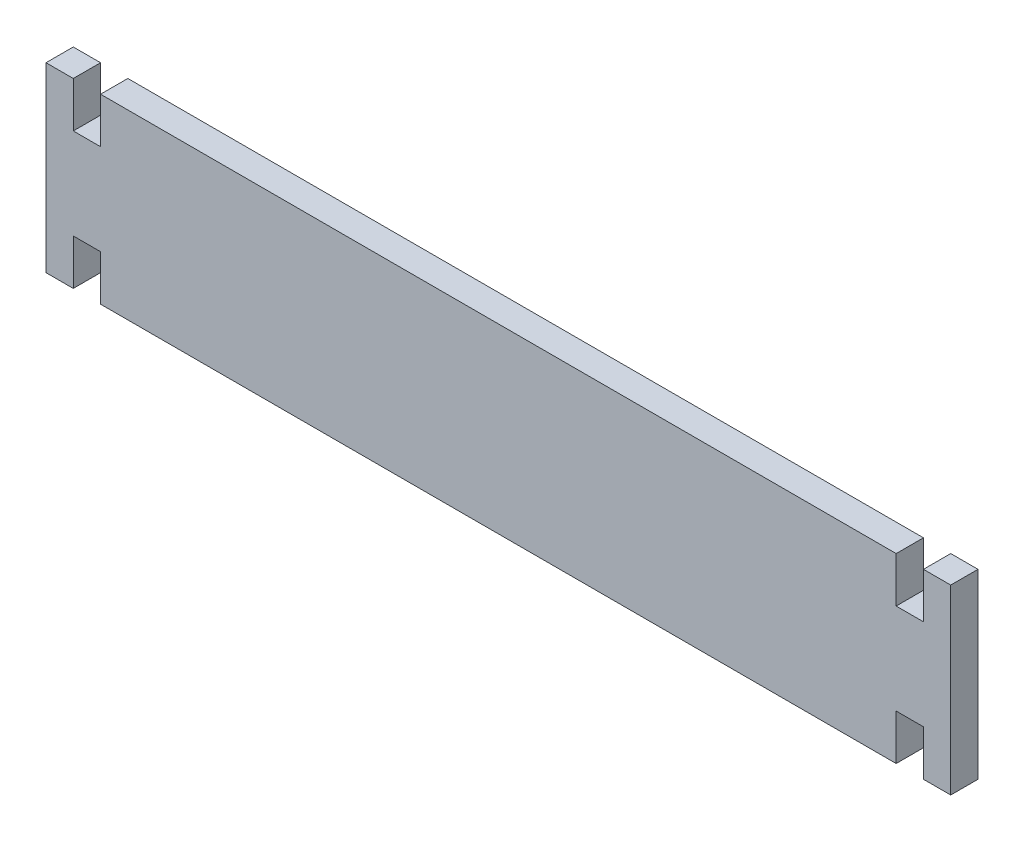
ISO-10303-21;
HEADER;
FILE_DESCRIPTION(('STEP AP214'),'2;1');
FILE_NAME('part.step','',(''),(''),'','','');
FILE_SCHEMA(('AUTOMOTIVE_DESIGN { 1 0 10303 214 1 1 1 1 }'));
ENDSEC;
DATA;
#1=APPLICATION_CONTEXT('core data for automotive mechanical design processes');
#2=APPLICATION_PROTOCOL_DEFINITION('international standard','automotive_design',2000,#1);
#3=PRODUCT_CONTEXT('',#1,'mechanical');
#4=PRODUCT('Part','Part','',(#3));
#5=PRODUCT_RELATED_PRODUCT_CATEGORY('part','',(#4));
#6=PRODUCT_DEFINITION_FORMATION('','',#4);
#7=PRODUCT_DEFINITION_CONTEXT('part definition',#1,'design');
#8=PRODUCT_DEFINITION('design','',#6,#7);
#9=PRODUCT_DEFINITION_SHAPE('','',#8);
#10=(LENGTH_UNIT() NAMED_UNIT(*) SI_UNIT(.MILLI.,.METRE.));
#11=(NAMED_UNIT(*) PLANE_ANGLE_UNIT() SI_UNIT($,.RADIAN.));
#12=(NAMED_UNIT(*) SI_UNIT($,.STERADIAN.) SOLID_ANGLE_UNIT());
#13=UNCERTAINTY_MEASURE_WITH_UNIT(LENGTH_MEASURE(1.E-05),#10,'distance_accuracy_value','');
#14=(GEOMETRIC_REPRESENTATION_CONTEXT(3) GLOBAL_UNCERTAINTY_ASSIGNED_CONTEXT((#13)) GLOBAL_UNIT_ASSIGNED_CONTEXT((#10,
#11,#12)) REPRESENTATION_CONTEXT('',''));
#15=CARTESIAN_POINT('',(0.,0.,0.));
#16=DIRECTION('',(0.,0.,1.));
#17=DIRECTION('',(1.,0.,0.));
#18=AXIS2_PLACEMENT_3D('',#15,#16,#17);
#19=CARTESIAN_POINT('',(0.,40.,6.));
#20=DIRECTION('',(0.,-1.,0.));
#21=DIRECTION('',(1.,0.,0.));
#22=AXIS2_PLACEMENT_3D('',#19,#20,#21);
#23=PLANE('',#22);
#24=DIRECTION('',(-1.,0.,0.));
#25=VECTOR('',#24,1.);
#26=CARTESIAN_POINT('',(0.,40.,6.));
#27=LINE('',#26,#25);
#28=CARTESIAN_POINT('',(-12.,40.,6.));
#29=VERTEX_POINT('',#28);
#30=CARTESIAN_POINT('',(-187.,40.,6.));
#31=VERTEX_POINT('',#30);
#32=EDGE_CURVE('E256',#29,#31,#27,.T.);
#33=ORIENTED_EDGE('',*,*,#32,.F.);
#34=DIRECTION('',(0.,0.,1.));
#35=VECTOR('',#34,1.);
#36=CARTESIAN_POINT('',(-12.,40.,0.));
#37=LINE('',#36,#35);
#38=CARTESIAN_POINT('',(-12.,40.,0.));
#39=VERTEX_POINT('',#38);
#40=EDGE_CURVE('E342',#39,#29,#37,.T.);
#41=ORIENTED_EDGE('',*,*,#40,.F.);
#42=DIRECTION('',(-1.,0.,0.));
#43=VECTOR('',#42,1.);
#44=CARTESIAN_POINT('',(0.,40.,0.));
#45=LINE('',#44,#43);
#46=CARTESIAN_POINT('',(-187.,40.,0.));
#47=VERTEX_POINT('',#46);
#48=EDGE_CURVE('E235',#39,#47,#45,.T.);
#49=ORIENTED_EDGE('',*,*,#48,.T.);
#50=DIRECTION('',(0.,0.,1.));
#51=VECTOR('',#50,1.);
#52=CARTESIAN_POINT('',(-187.,40.,0.));
#53=LINE('',#52,#51);
#54=EDGE_CURVE('E265',#47,#31,#53,.T.);
#55=ORIENTED_EDGE('',*,*,#54,.T.);
#56=EDGE_LOOP('',(#33,#41,#49,#55));
#57=FACE_BOUND('',#56,.T.);
#58=ADVANCED_FACE('F44',(#57),#23,.F.);
#59=CARTESIAN_POINT('',(0.,0.,6.));
#60=DIRECTION('',(0.,1.,0.));
#61=DIRECTION('',(-1.,0.,0.));
#62=AXIS2_PLACEMENT_3D('',#59,#60,#61);
#63=PLANE('',#62);
#64=DIRECTION('',(1.,0.,0.));
#65=VECTOR('',#64,1.);
#66=CARTESIAN_POINT('',(0.,0.,0.));
#67=LINE('',#66,#65);
#68=CARTESIAN_POINT('',(-199.,0.,0.));
#69=VERTEX_POINT('',#68);
#70=CARTESIAN_POINT('',(-193.,0.,0.));
#71=VERTEX_POINT('',#70);
#72=EDGE_CURVE('E199',#69,#71,#67,.T.);
#73=ORIENTED_EDGE('',*,*,#72,.T.);
#74=DIRECTION('',(0.,0.,1.));
#75=VECTOR('',#74,1.);
#76=CARTESIAN_POINT('',(-193.,0.,0.));
#77=LINE('',#76,#75);
#78=CARTESIAN_POINT('',(-193.,0.,6.));
#79=VERTEX_POINT('',#78);
#80=EDGE_CURVE('E182',#71,#79,#77,.T.);
#81=ORIENTED_EDGE('',*,*,#80,.T.);
#82=DIRECTION('',(1.,0.,0.));
#83=VECTOR('',#82,1.);
#84=CARTESIAN_POINT('',(0.,0.,6.));
#85=LINE('',#84,#83);
#86=CARTESIAN_POINT('',(-199.,0.,6.));
#87=VERTEX_POINT('',#86);
#88=EDGE_CURVE('E244',#87,#79,#85,.T.);
#89=ORIENTED_EDGE('',*,*,#88,.F.);
#90=DIRECTION('',(0.,0.,-1.));
#91=VECTOR('',#90,1.);
#92=CARTESIAN_POINT('',(-199.,0.,6.));
#93=LINE('',#92,#91);
#94=EDGE_CURVE('E208',#87,#69,#93,.T.);
#95=ORIENTED_EDGE('',*,*,#94,.T.);
#96=EDGE_LOOP('',(#73,#81,#89,#95));
#97=FACE_BOUND('',#96,.T.);
#98=ADVANCED_FACE('F206',(#97),#63,.F.);
#99=CARTESIAN_POINT('',(-187.,0.,6.));
#100=VERTEX_POINT('',#99);
#101=CARTESIAN_POINT('',(-12.,0.,6.));
#102=VERTEX_POINT('',#101);
#103=EDGE_CURVE('E248',#100,#102,#85,.T.);
#104=ORIENTED_EDGE('',*,*,#103,.F.);
#105=DIRECTION('',(0.,0.,1.));
#106=VECTOR('',#105,1.);
#107=CARTESIAN_POINT('',(-187.,0.,0.));
#108=LINE('',#107,#106);
#109=CARTESIAN_POINT('',(-187.,0.,0.));
#110=VERTEX_POINT('',#109);
#111=EDGE_CURVE('E193',#110,#100,#108,.T.);
#112=ORIENTED_EDGE('',*,*,#111,.F.);
#113=CARTESIAN_POINT('',(-12.,0.,0.));
#114=VERTEX_POINT('',#113);
#115=EDGE_CURVE('E211',#110,#114,#67,.T.);
#116=ORIENTED_EDGE('',*,*,#115,.T.);
#117=DIRECTION('',(0.,0.,1.));
#118=VECTOR('',#117,1.);
#119=CARTESIAN_POINT('',(-12.,0.,0.));
#120=LINE('',#119,#118);
#121=EDGE_CURVE('E295',#114,#102,#120,.T.);
#122=ORIENTED_EDGE('',*,*,#121,.T.);
#123=EDGE_LOOP('',(#104,#112,#116,#122));
#124=FACE_BOUND('',#123,.T.);
#125=ADVANCED_FACE('F391',(#124),#63,.F.);
#126=CARTESIAN_POINT('',(-193.,40.,6.));
#127=VERTEX_POINT('',#126);
#128=CARTESIAN_POINT('',(-199.,40.,6.));
#129=VERTEX_POINT('',#128);
#130=EDGE_CURVE('E217',#127,#129,#27,.T.);
#131=ORIENTED_EDGE('',*,*,#130,.F.);
#132=DIRECTION('',(0.,0.,1.));
#133=VECTOR('',#132,1.);
#134=CARTESIAN_POINT('',(-193.,40.,0.));
#135=LINE('',#134,#133);
#136=CARTESIAN_POINT('',(-193.,40.,0.));
#137=VERTEX_POINT('',#136);
#138=EDGE_CURVE('E243',#137,#127,#135,.T.);
#139=ORIENTED_EDGE('',*,*,#138,.F.);
#140=CARTESIAN_POINT('',(-199.,40.,0.));
#141=VERTEX_POINT('',#140);
#142=EDGE_CURVE('E237',#137,#141,#45,.T.);
#143=ORIENTED_EDGE('',*,*,#142,.T.);
#144=DIRECTION('',(0.,0.,-1.));
#145=VECTOR('',#144,1.);
#146=CARTESIAN_POINT('',(-199.,40.,6.));
#147=LINE('',#146,#145);
#148=EDGE_CURVE('E53',#129,#141,#147,.T.);
#149=ORIENTED_EDGE('',*,*,#148,.F.);
#150=EDGE_LOOP('',(#131,#139,#143,#149));
#151=FACE_BOUND('',#150,.T.);
#152=ADVANCED_FACE('F433',(#151),#23,.F.);
#153=CARTESIAN_POINT('',(0.,0.,6.));
#154=DIRECTION('',(-1.,0.,0.));
#155=DIRECTION('',(0.,0.,1.));
#156=AXIS2_PLACEMENT_3D('',#153,#154,#155);
#157=PLANE('',#156);
#158=DIRECTION('',(0.,1.,0.));
#159=VECTOR('',#158,1.);
#160=CARTESIAN_POINT('',(0.,0.,0.));
#161=LINE('',#160,#159);
#162=CARTESIAN_POINT('',(0.,0.,0.));
#163=VERTEX_POINT('',#162);
#164=CARTESIAN_POINT('',(0.,40.,0.));
#165=VERTEX_POINT('',#164);
#166=EDGE_CURVE('E239',#163,#165,#161,.T.);
#167=ORIENTED_EDGE('',*,*,#166,.T.);
#168=DIRECTION('',(0.,0.,-1.));
#169=VECTOR('',#168,1.);
#170=CARTESIAN_POINT('',(0.,40.,6.));
#171=LINE('',#170,#169);
#172=CARTESIAN_POINT('',(0.,40.,6.));
#173=VERTEX_POINT('',#172);
#174=EDGE_CURVE('E11',#173,#165,#171,.T.);
#175=ORIENTED_EDGE('',*,*,#174,.F.);
#176=DIRECTION('',(0.,1.,0.));
#177=VECTOR('',#176,1.);
#178=CARTESIAN_POINT('',(0.,0.,6.));
#179=LINE('',#178,#177);
#180=CARTESIAN_POINT('',(0.,0.,6.));
#181=VERTEX_POINT('',#180);
#182=EDGE_CURVE('E210',#181,#173,#179,.T.);
#183=ORIENTED_EDGE('',*,*,#182,.F.);
#184=DIRECTION('',(0.,0.,-1.));
#185=VECTOR('',#184,1.);
#186=CARTESIAN_POINT('',(0.,0.,6.));
#187=LINE('',#186,#185);
#188=EDGE_CURVE('E247',#181,#163,#187,.T.);
#189=ORIENTED_EDGE('',*,*,#188,.T.);
#190=EDGE_LOOP('',(#167,#175,#183,#189));
#191=FACE_BOUND('',#190,.T.);
#192=ADVANCED_FACE('F46',(#191),#157,.F.);
#193=CARTESIAN_POINT('',(-6.00000000000001,40.,0.));
#194=VERTEX_POINT('',#193);
#195=EDGE_CURVE('E230',#165,#194,#45,.T.);
#196=ORIENTED_EDGE('',*,*,#195,.T.);
#197=DIRECTION('',(0.,0.,1.));
#198=VECTOR('',#197,1.);
#199=CARTESIAN_POINT('',(-6.00000000000001,40.,0.));
#200=LINE('',#199,#198);
#201=CARTESIAN_POINT('',(-6.00000000000001,40.,6.));
#202=VERTEX_POINT('',#201);
#203=EDGE_CURVE('E338',#194,#202,#200,.T.);
#204=ORIENTED_EDGE('',*,*,#203,.T.);
#205=EDGE_CURVE('E253',#173,#202,#27,.T.);
#206=ORIENTED_EDGE('',*,*,#205,.F.);
#207=ORIENTED_EDGE('',*,*,#174,.T.);
#208=EDGE_LOOP('',(#196,#204,#206,#207));
#209=FACE_BOUND('',#208,.T.);
#210=ADVANCED_FACE('F408',(#209),#23,.F.);
#211=CARTESIAN_POINT('',(-199.,0.,6.));
#212=DIRECTION('',(1.,0.,0.));
#213=DIRECTION('',(0.,0.,-1.));
#214=AXIS2_PLACEMENT_3D('',#211,#212,#213);
#215=PLANE('',#214);
#216=DIRECTION('',(0.,-1.,0.));
#217=VECTOR('',#216,1.);
#218=CARTESIAN_POINT('',(-199.,0.,0.));
#219=LINE('',#218,#217);
#220=EDGE_CURVE('E223',#141,#69,#219,.T.);
#221=ORIENTED_EDGE('',*,*,#220,.T.);
#222=ORIENTED_EDGE('',*,*,#94,.F.);
#223=DIRECTION('',(0.,-1.,0.));
#224=VECTOR('',#223,1.);
#225=CARTESIAN_POINT('',(-199.,0.,6.));
#226=LINE('',#225,#224);
#227=EDGE_CURVE('E250',#129,#87,#226,.T.);
#228=ORIENTED_EDGE('',*,*,#227,.F.);
#229=ORIENTED_EDGE('',*,*,#148,.T.);
#230=EDGE_LOOP('',(#221,#222,#228,#229));
#231=FACE_BOUND('',#230,.T.);
#232=ADVANCED_FACE('F436',(#231),#215,.F.);
#233=CARTESIAN_POINT('',(-6.00000000000001,0.,6.));
#234=VERTEX_POINT('',#233);
#235=EDGE_CURVE('E249',#234,#181,#85,.T.);
#236=ORIENTED_EDGE('',*,*,#235,.F.);
#237=DIRECTION('',(0.,0.,1.));
#238=VECTOR('',#237,1.);
#239=CARTESIAN_POINT('',(-6.00000000000001,0.,0.));
#240=LINE('',#239,#238);
#241=CARTESIAN_POINT('',(-6.00000000000001,0.,0.));
#242=VERTEX_POINT('',#241);
#243=EDGE_CURVE('E299',#242,#234,#240,.T.);
#244=ORIENTED_EDGE('',*,*,#243,.F.);
#245=EDGE_CURVE('E213',#242,#163,#67,.T.);
#246=ORIENTED_EDGE('',*,*,#245,.T.);
#247=ORIENTED_EDGE('',*,*,#188,.F.);
#248=EDGE_LOOP('',(#236,#244,#246,#247));
#249=FACE_BOUND('',#248,.T.);
#250=ADVANCED_FACE('F403',(#249),#63,.F.);
#251=CARTESIAN_POINT('',(0.,0.,6.));
#252=DIRECTION('',(0.,0.,1.));
#253=DIRECTION('',(1.,0.,0.));
#254=AXIS2_PLACEMENT_3D('',#251,#252,#253);
#255=PLANE('',#254);
#256=DIRECTION('',(0.,-1.,0.));
#257=VECTOR('',#256,1.);
#258=CARTESIAN_POINT('',(-193.,10.,6.));
#259=LINE('',#258,#257);
#260=CARTESIAN_POINT('',(-193.,10.,6.));
#261=VERTEX_POINT('',#260);
#262=EDGE_CURVE('E187',#261,#79,#259,.T.);
#263=ORIENTED_EDGE('',*,*,#262,.F.);
#264=DIRECTION('',(-1.,0.,0.));
#265=VECTOR('',#264,1.);
#266=CARTESIAN_POINT('',(-193.,10.,6.));
#267=LINE('',#266,#265);
#268=CARTESIAN_POINT('',(-187.,10.,6.));
#269=VERTEX_POINT('',#268);
#270=EDGE_CURVE('E203',#269,#261,#267,.T.);
#271=ORIENTED_EDGE('',*,*,#270,.F.);
#272=DIRECTION('',(0.,1.,0.));
#273=VECTOR('',#272,1.);
#274=CARTESIAN_POINT('',(-187.,10.,6.));
#275=LINE('',#274,#273);
#276=EDGE_CURVE('E375',#100,#269,#275,.T.);
#277=ORIENTED_EDGE('',*,*,#276,.F.);
#278=ORIENTED_EDGE('',*,*,#103,.T.);
#279=DIRECTION('',(0.,-1.,0.));
#280=VECTOR('',#279,1.);
#281=CARTESIAN_POINT('',(-12.,10.,6.));
#282=LINE('',#281,#280);
#283=CARTESIAN_POINT('',(-12.,10.,6.));
#284=VERTEX_POINT('',#283);
#285=EDGE_CURVE('E319',#284,#102,#282,.T.);
#286=ORIENTED_EDGE('',*,*,#285,.F.);
#287=DIRECTION('',(-1.,0.,0.));
#288=VECTOR('',#287,1.);
#289=CARTESIAN_POINT('',(-12.,10.,6.));
#290=LINE('',#289,#288);
#291=CARTESIAN_POINT('',(-6.00000000000001,10.,6.));
#292=VERTEX_POINT('',#291);
#293=EDGE_CURVE('E310',#292,#284,#290,.T.);
#294=ORIENTED_EDGE('',*,*,#293,.F.);
#295=DIRECTION('',(0.,1.,0.));
#296=VECTOR('',#295,1.);
#297=CARTESIAN_POINT('',(-6.00000000000001,10.,6.));
#298=LINE('',#297,#296);
#299=EDGE_CURVE('E315',#234,#292,#298,.T.);
#300=ORIENTED_EDGE('',*,*,#299,.F.);
#301=ORIENTED_EDGE('',*,*,#235,.T.);
#302=ORIENTED_EDGE('',*,*,#182,.T.);
#303=ORIENTED_EDGE('',*,*,#205,.T.);
#304=DIRECTION('',(0.,1.,0.));
#305=VECTOR('',#304,1.);
#306=CARTESIAN_POINT('',(-6.00000000000001,40.,6.));
#307=LINE('',#306,#305);
#308=CARTESIAN_POINT('',(-6.00000000000001,30.,6.));
#309=VERTEX_POINT('',#308);
#310=EDGE_CURVE('E345',#309,#202,#307,.T.);
#311=ORIENTED_EDGE('',*,*,#310,.F.);
#312=DIRECTION('',(1.,0.,0.));
#313=VECTOR('',#312,1.);
#314=CARTESIAN_POINT('',(-12.,30.,6.));
#315=LINE('',#314,#313);
#316=CARTESIAN_POINT('',(-12.,30.,6.));
#317=VERTEX_POINT('',#316);
#318=EDGE_CURVE('E349',#317,#309,#315,.T.);
#319=ORIENTED_EDGE('',*,*,#318,.F.);
#320=DIRECTION('',(0.,-1.,0.));
#321=VECTOR('',#320,1.);
#322=CARTESIAN_POINT('',(-12.,40.,6.));
#323=LINE('',#322,#321);
#324=EDGE_CURVE('E309',#29,#317,#323,.T.);
#325=ORIENTED_EDGE('',*,*,#324,.F.);
#326=ORIENTED_EDGE('',*,*,#32,.T.);
#327=DIRECTION('',(0.,1.,0.));
#328=VECTOR('',#327,1.);
#329=CARTESIAN_POINT('',(-187.,40.,6.));
#330=LINE('',#329,#328);
#331=CARTESIAN_POINT('',(-187.,30.,6.));
#332=VERTEX_POINT('',#331);
#333=EDGE_CURVE('E271',#332,#31,#330,.T.);
#334=ORIENTED_EDGE('',*,*,#333,.F.);
#335=DIRECTION('',(1.,0.,0.));
#336=VECTOR('',#335,1.);
#337=CARTESIAN_POINT('',(-193.,30.,6.));
#338=LINE('',#337,#336);
#339=CARTESIAN_POINT('',(-193.,30.,6.));
#340=VERTEX_POINT('',#339);
#341=EDGE_CURVE('E276',#340,#332,#338,.T.);
#342=ORIENTED_EDGE('',*,*,#341,.F.);
#343=DIRECTION('',(0.,-1.,0.));
#344=VECTOR('',#343,1.);
#345=CARTESIAN_POINT('',(-193.,40.,6.));
#346=LINE('',#345,#344);
#347=EDGE_CURVE('E280',#127,#340,#346,.T.);
#348=ORIENTED_EDGE('',*,*,#347,.F.);
#349=ORIENTED_EDGE('',*,*,#130,.T.);
#350=ORIENTED_EDGE('',*,*,#227,.T.);
#351=ORIENTED_EDGE('',*,*,#88,.T.);
#352=EDGE_LOOP('',(#263,#271,#277,#278,#286,#294,#300,#301,#302,#303,#311,#319,#325,#326,#334,
#342,#348,#349,#350,#351));
#353=FACE_BOUND('',#352,.T.);
#354=ADVANCED_FACE('F399',(#353),#255,.T.);
#355=CARTESIAN_POINT('',(0.,0.,0.));
#356=DIRECTION('',(0.,0.,1.));
#357=DIRECTION('',(1.,0.,0.));
#358=AXIS2_PLACEMENT_3D('',#355,#356,#357);
#359=PLANE('',#358);
#360=DIRECTION('',(-1.,0.,0.));
#361=VECTOR('',#360,1.);
#362=CARTESIAN_POINT('',(-193.,10.,0.));
#363=LINE('',#362,#361);
#364=CARTESIAN_POINT('',(-187.,10.,0.));
#365=VERTEX_POINT('',#364);
#366=CARTESIAN_POINT('',(-193.,10.,0.));
#367=VERTEX_POINT('',#366);
#368=EDGE_CURVE('E60',#365,#367,#363,.T.);
#369=ORIENTED_EDGE('',*,*,#368,.T.);
#370=DIRECTION('',(0.,-1.,0.));
#371=VECTOR('',#370,1.);
#372=CARTESIAN_POINT('',(-193.,10.,0.));
#373=LINE('',#372,#371);
#374=EDGE_CURVE('E185',#367,#71,#373,.T.);
#375=ORIENTED_EDGE('',*,*,#374,.T.);
#376=ORIENTED_EDGE('',*,*,#72,.F.);
#377=ORIENTED_EDGE('',*,*,#220,.F.);
#378=ORIENTED_EDGE('',*,*,#142,.F.);
#379=DIRECTION('',(0.,-1.,0.));
#380=VECTOR('',#379,1.);
#381=CARTESIAN_POINT('',(-193.,40.,0.));
#382=LINE('',#381,#380);
#383=CARTESIAN_POINT('',(-193.,30.,0.));
#384=VERTEX_POINT('',#383);
#385=EDGE_CURVE('E275',#137,#384,#382,.T.);
#386=ORIENTED_EDGE('',*,*,#385,.T.);
#387=DIRECTION('',(1.,0.,0.));
#388=VECTOR('',#387,1.);
#389=CARTESIAN_POINT('',(-193.,30.,0.));
#390=LINE('',#389,#388);
#391=CARTESIAN_POINT('',(-187.,30.,0.));
#392=VERTEX_POINT('',#391);
#393=EDGE_CURVE('E288',#384,#392,#390,.T.);
#394=ORIENTED_EDGE('',*,*,#393,.T.);
#395=DIRECTION('',(0.,1.,0.));
#396=VECTOR('',#395,1.);
#397=CARTESIAN_POINT('',(-187.,40.,0.));
#398=LINE('',#397,#396);
#399=EDGE_CURVE('E262',#392,#47,#398,.T.);
#400=ORIENTED_EDGE('',*,*,#399,.T.);
#401=ORIENTED_EDGE('',*,*,#48,.F.);
#402=DIRECTION('',(0.,-1.,0.));
#403=VECTOR('',#402,1.);
#404=CARTESIAN_POINT('',(-12.,40.,0.));
#405=LINE('',#404,#403);
#406=CARTESIAN_POINT('',(-12.,30.,0.));
#407=VERTEX_POINT('',#406);
#408=EDGE_CURVE('E348',#39,#407,#405,.T.);
#409=ORIENTED_EDGE('',*,*,#408,.T.);
#410=DIRECTION('',(1.,0.,0.));
#411=VECTOR('',#410,1.);
#412=CARTESIAN_POINT('',(-12.,30.,0.));
#413=LINE('',#412,#411);
#414=CARTESIAN_POINT('',(-6.00000000000001,30.,0.));
#415=VERTEX_POINT('',#414);
#416=EDGE_CURVE('E358',#407,#415,#413,.T.);
#417=ORIENTED_EDGE('',*,*,#416,.T.);
#418=DIRECTION('',(0.,1.,0.));
#419=VECTOR('',#418,1.);
#420=CARTESIAN_POINT('',(-6.00000000000001,40.,0.));
#421=LINE('',#420,#419);
#422=EDGE_CURVE('E68',#415,#194,#421,.T.);
#423=ORIENTED_EDGE('',*,*,#422,.T.);
#424=ORIENTED_EDGE('',*,*,#195,.F.);
#425=ORIENTED_EDGE('',*,*,#166,.F.);
#426=ORIENTED_EDGE('',*,*,#245,.F.);
#427=DIRECTION('',(0.,1.,0.));
#428=VECTOR('',#427,1.);
#429=CARTESIAN_POINT('',(-6.00000000000001,10.,0.));
#430=LINE('',#429,#428);
#431=CARTESIAN_POINT('',(-6.00000000000001,10.,0.));
#432=VERTEX_POINT('',#431);
#433=EDGE_CURVE('E325',#242,#432,#430,.T.);
#434=ORIENTED_EDGE('',*,*,#433,.T.);
#435=DIRECTION('',(-1.,0.,0.));
#436=VECTOR('',#435,1.);
#437=CARTESIAN_POINT('',(-12.,10.,0.));
#438=LINE('',#437,#436);
#439=CARTESIAN_POINT('',(-12.,10.,0.));
#440=VERTEX_POINT('',#439);
#441=EDGE_CURVE('E300',#432,#440,#438,.T.);
#442=ORIENTED_EDGE('',*,*,#441,.T.);
#443=DIRECTION('',(0.,-1.,0.));
#444=VECTOR('',#443,1.);
#445=CARTESIAN_POINT('',(-12.,10.,0.));
#446=LINE('',#445,#444);
#447=EDGE_CURVE('E314',#440,#114,#446,.T.);
#448=ORIENTED_EDGE('',*,*,#447,.T.);
#449=ORIENTED_EDGE('',*,*,#115,.F.);
#450=DIRECTION('',(0.,1.,0.));
#451=VECTOR('',#450,1.);
#452=CARTESIAN_POINT('',(-187.,10.,0.));
#453=LINE('',#452,#451);
#454=EDGE_CURVE('E202',#110,#365,#453,.T.);
#455=ORIENTED_EDGE('',*,*,#454,.T.);
#456=EDGE_LOOP('',(#369,#375,#376,#377,#378,#386,#394,#400,#401,#409,#417,#423,#424,#425,#426,
#434,#442,#448,#449,#455));
#457=FACE_BOUND('',#456,.T.);
#458=ADVANCED_FACE('F197',(#457),#359,.F.);
#459=CARTESIAN_POINT('',(-193.,40.,0.));
#460=DIRECTION('',(-1.,0.,0.));
#461=DIRECTION('',(0.,0.,1.));
#462=AXIS2_PLACEMENT_3D('',#459,#460,#461);
#463=PLANE('',#462);
#464=ORIENTED_EDGE('',*,*,#347,.T.);
#465=DIRECTION('',(0.,0.,1.));
#466=VECTOR('',#465,1.);
#467=CARTESIAN_POINT('',(-193.,30.,0.));
#468=LINE('',#467,#466);
#469=EDGE_CURVE('E258',#384,#340,#468,.T.);
#470=ORIENTED_EDGE('',*,*,#469,.F.);
#471=ORIENTED_EDGE('',*,*,#385,.F.);
#472=ORIENTED_EDGE('',*,*,#138,.T.);
#473=EDGE_LOOP('',(#464,#470,#471,#472));
#474=FACE_BOUND('',#473,.T.);
#475=ADVANCED_FACE('F498',(#474),#463,.F.);
#476=CARTESIAN_POINT('',(-187.,40.,0.));
#477=DIRECTION('',(1.,0.,0.));
#478=DIRECTION('',(0.,0.,-1.));
#479=AXIS2_PLACEMENT_3D('',#476,#477,#478);
#480=PLANE('',#479);
#481=ORIENTED_EDGE('',*,*,#333,.T.);
#482=ORIENTED_EDGE('',*,*,#54,.F.);
#483=ORIENTED_EDGE('',*,*,#399,.F.);
#484=DIRECTION('',(0.,0.,1.));
#485=VECTOR('',#484,1.);
#486=CARTESIAN_POINT('',(-187.,30.,0.));
#487=LINE('',#486,#485);
#488=EDGE_CURVE('E261',#392,#332,#487,.T.);
#489=ORIENTED_EDGE('',*,*,#488,.T.);
#490=EDGE_LOOP('',(#481,#482,#483,#489));
#491=FACE_BOUND('',#490,.T.);
#492=ADVANCED_FACE('F535',(#491),#480,.F.);
#493=CARTESIAN_POINT('',(-193.,30.,0.));
#494=DIRECTION('',(0.,-1.,0.));
#495=DIRECTION('',(0.,0.,-1.));
#496=AXIS2_PLACEMENT_3D('',#493,#494,#495);
#497=PLANE('',#496);
#498=ORIENTED_EDGE('',*,*,#341,.T.);
#499=ORIENTED_EDGE('',*,*,#488,.F.);
#500=ORIENTED_EDGE('',*,*,#393,.F.);
#501=ORIENTED_EDGE('',*,*,#469,.T.);
#502=EDGE_LOOP('',(#498,#499,#500,#501));
#503=FACE_BOUND('',#502,.T.);
#504=ADVANCED_FACE('F542',(#503),#497,.F.);
#505=CARTESIAN_POINT('',(-12.,10.,0.));
#506=DIRECTION('',(-1.,0.,0.));
#507=DIRECTION('',(0.,0.,1.));
#508=AXIS2_PLACEMENT_3D('',#505,#506,#507);
#509=PLANE('',#508);
#510=ORIENTED_EDGE('',*,*,#285,.T.);
#511=ORIENTED_EDGE('',*,*,#121,.F.);
#512=ORIENTED_EDGE('',*,*,#447,.F.);
#513=DIRECTION('',(0.,0.,1.));
#514=VECTOR('',#513,1.);
#515=CARTESIAN_POINT('',(-12.,10.,0.));
#516=LINE('',#515,#514);
#517=EDGE_CURVE('E306',#440,#284,#516,.T.);
#518=ORIENTED_EDGE('',*,*,#517,.T.);
#519=EDGE_LOOP('',(#510,#511,#512,#518));
#520=FACE_BOUND('',#519,.T.);
#521=ADVANCED_FACE('F549',(#520),#509,.F.);
#522=CARTESIAN_POINT('',(-12.,10.,0.));
#523=DIRECTION('',(0.,1.,0.));
#524=DIRECTION('',(0.,0.,1.));
#525=AXIS2_PLACEMENT_3D('',#522,#523,#524);
#526=PLANE('',#525);
#527=ORIENTED_EDGE('',*,*,#293,.T.);
#528=ORIENTED_EDGE('',*,*,#517,.F.);
#529=ORIENTED_EDGE('',*,*,#441,.F.);
#530=DIRECTION('',(0.,0.,1.));
#531=VECTOR('',#530,1.);
#532=CARTESIAN_POINT('',(-6.00000000000001,10.,0.));
#533=LINE('',#532,#531);
#534=EDGE_CURVE('E303',#432,#292,#533,.T.);
#535=ORIENTED_EDGE('',*,*,#534,.T.);
#536=EDGE_LOOP('',(#527,#528,#529,#535));
#537=FACE_BOUND('',#536,.T.);
#538=ADVANCED_FACE('F555',(#537),#526,.F.);
#539=CARTESIAN_POINT('',(-6.00000000000001,10.,0.));
#540=DIRECTION('',(1.,0.,0.));
#541=DIRECTION('',(0.,0.,-1.));
#542=AXIS2_PLACEMENT_3D('',#539,#540,#541);
#543=PLANE('',#542);
#544=ORIENTED_EDGE('',*,*,#299,.T.);
#545=ORIENTED_EDGE('',*,*,#534,.F.);
#546=ORIENTED_EDGE('',*,*,#433,.F.);
#547=ORIENTED_EDGE('',*,*,#243,.T.);
#548=EDGE_LOOP('',(#544,#545,#546,#547));
#549=FACE_BOUND('',#548,.T.);
#550=ADVANCED_FACE('F562',(#549),#543,.F.);
#551=CARTESIAN_POINT('',(-12.,40.,0.));
#552=DIRECTION('',(-1.,0.,0.));
#553=DIRECTION('',(0.,0.,1.));
#554=AXIS2_PLACEMENT_3D('',#551,#552,#553);
#555=PLANE('',#554);
#556=ORIENTED_EDGE('',*,*,#324,.T.);
#557=DIRECTION('',(0.,0.,1.));
#558=VECTOR('',#557,1.);
#559=CARTESIAN_POINT('',(-12.,30.,0.));
#560=LINE('',#559,#558);
#561=EDGE_CURVE('E332',#407,#317,#560,.T.);
#562=ORIENTED_EDGE('',*,*,#561,.F.);
#563=ORIENTED_EDGE('',*,*,#408,.F.);
#564=ORIENTED_EDGE('',*,*,#40,.T.);
#565=EDGE_LOOP('',(#556,#562,#563,#564));
#566=FACE_BOUND('',#565,.T.);
#567=ADVANCED_FACE('F417',(#566),#555,.F.);
#568=CARTESIAN_POINT('',(-6.00000000000001,40.,0.));
#569=DIRECTION('',(1.,0.,0.));
#570=DIRECTION('',(0.,0.,-1.));
#571=AXIS2_PLACEMENT_3D('',#568,#569,#570);
#572=PLANE('',#571);
#573=ORIENTED_EDGE('',*,*,#310,.T.);
#574=ORIENTED_EDGE('',*,*,#203,.F.);
#575=ORIENTED_EDGE('',*,*,#422,.F.);
#576=DIRECTION('',(0.,0.,1.));
#577=VECTOR('',#576,1.);
#578=CARTESIAN_POINT('',(-6.00000000000001,30.,0.));
#579=LINE('',#578,#577);
#580=EDGE_CURVE('E335',#415,#309,#579,.T.);
#581=ORIENTED_EDGE('',*,*,#580,.T.);
#582=EDGE_LOOP('',(#573,#574,#575,#581));
#583=FACE_BOUND('',#582,.T.);
#584=ADVANCED_FACE('F412',(#583),#572,.F.);
#585=CARTESIAN_POINT('',(-12.,30.,0.));
#586=DIRECTION('',(0.,-1.,0.));
#587=DIRECTION('',(0.,0.,-1.));
#588=AXIS2_PLACEMENT_3D('',#585,#586,#587);
#589=PLANE('',#588);
#590=ORIENTED_EDGE('',*,*,#318,.T.);
#591=ORIENTED_EDGE('',*,*,#580,.F.);
#592=ORIENTED_EDGE('',*,*,#416,.F.);
#593=ORIENTED_EDGE('',*,*,#561,.T.);
#594=EDGE_LOOP('',(#590,#591,#592,#593));
#595=FACE_BOUND('',#594,.T.);
#596=ADVANCED_FACE('F415',(#595),#589,.F.);
#597=CARTESIAN_POINT('',(-193.,10.,0.));
#598=DIRECTION('',(-1.,0.,0.));
#599=DIRECTION('',(0.,0.,1.));
#600=AXIS2_PLACEMENT_3D('',#597,#598,#599);
#601=PLANE('',#600);
#602=ORIENTED_EDGE('',*,*,#262,.T.);
#603=ORIENTED_EDGE('',*,*,#80,.F.);
#604=ORIENTED_EDGE('',*,*,#374,.F.);
#605=DIRECTION('',(0.,0.,1.));
#606=VECTOR('',#605,1.);
#607=CARTESIAN_POINT('',(-193.,10.,0.));
#608=LINE('',#607,#606);
#609=EDGE_CURVE('E284',#367,#261,#608,.T.);
#610=ORIENTED_EDGE('',*,*,#609,.T.);
#611=EDGE_LOOP('',(#602,#603,#604,#610));
#612=FACE_BOUND('',#611,.T.);
#613=ADVANCED_FACE('F184',(#612),#601,.F.);
#614=CARTESIAN_POINT('',(-193.,10.,0.));
#615=DIRECTION('',(0.,1.,0.));
#616=DIRECTION('',(0.,0.,1.));
#617=AXIS2_PLACEMENT_3D('',#614,#615,#616);
#618=PLANE('',#617);
#619=ORIENTED_EDGE('',*,*,#270,.T.);
#620=ORIENTED_EDGE('',*,*,#609,.F.);
#621=ORIENTED_EDGE('',*,*,#368,.F.);
#622=DIRECTION('',(0.,0.,1.));
#623=VECTOR('',#622,1.);
#624=CARTESIAN_POINT('',(-187.,10.,0.));
#625=LINE('',#624,#623);
#626=EDGE_CURVE('E367',#365,#269,#625,.T.);
#627=ORIENTED_EDGE('',*,*,#626,.T.);
#628=EDGE_LOOP('',(#619,#620,#621,#627));
#629=FACE_BOUND('',#628,.T.);
#630=ADVANCED_FACE('F440',(#629),#618,.F.);
#631=CARTESIAN_POINT('',(-187.,10.,0.));
#632=DIRECTION('',(1.,0.,0.));
#633=DIRECTION('',(0.,0.,-1.));
#634=AXIS2_PLACEMENT_3D('',#631,#632,#633);
#635=PLANE('',#634);
#636=ORIENTED_EDGE('',*,*,#276,.T.);
#637=ORIENTED_EDGE('',*,*,#626,.F.);
#638=ORIENTED_EDGE('',*,*,#454,.F.);
#639=ORIENTED_EDGE('',*,*,#111,.T.);
#640=EDGE_LOOP('',(#636,#637,#638,#639));
#641=FACE_BOUND('',#640,.T.);
#642=ADVANCED_FACE('F387',(#641),#635,.F.);
#643=CLOSED_SHELL('',(#58,#98,#125,#152,#192,#210,#232,#250,#354,#458,#475,#492,#504,#521,#538,
#550,#567,#584,#596,#613,#630,#642));
#644=MANIFOLD_SOLID_BREP('B2',#643);
#645=ADVANCED_BREP_SHAPE_REPRESENTATION('',(#18,#644),#14);
#646=SHAPE_DEFINITION_REPRESENTATION(#9,#645);
ENDSEC;
END-ISO-10303-21;
